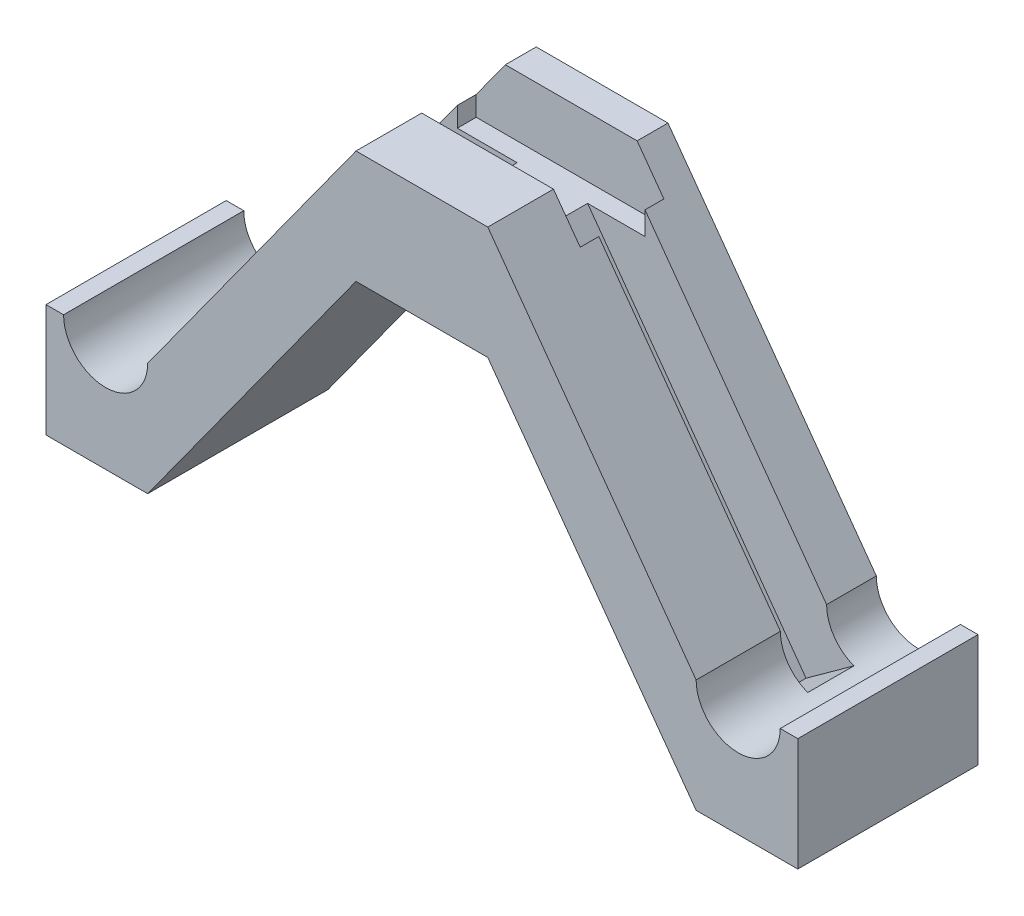
ISO-10303-21;
HEADER;
FILE_DESCRIPTION(('STEP AP214'),'2;1');
FILE_NAME('part.step','',(''),(''),'','','');
FILE_SCHEMA(('AUTOMOTIVE_DESIGN { 1 0 10303 214 1 1 1 1 }'));
ENDSEC;
DATA;
#1=APPLICATION_CONTEXT('core data for automotive mechanical design processes');
#2=APPLICATION_PROTOCOL_DEFINITION('international standard','automotive_design',2000,#1);
#3=PRODUCT_CONTEXT('',#1,'mechanical');
#4=PRODUCT('Part','Part','',(#3));
#5=PRODUCT_RELATED_PRODUCT_CATEGORY('part','',(#4));
#6=PRODUCT_DEFINITION_FORMATION('','',#4);
#7=PRODUCT_DEFINITION_CONTEXT('part definition',#1,'design');
#8=PRODUCT_DEFINITION('design','',#6,#7);
#9=PRODUCT_DEFINITION_SHAPE('','',#8);
#10=(LENGTH_UNIT() NAMED_UNIT(*) SI_UNIT(.MILLI.,.METRE.));
#11=(NAMED_UNIT(*) PLANE_ANGLE_UNIT() SI_UNIT($,.RADIAN.));
#12=(NAMED_UNIT(*) SI_UNIT($,.STERADIAN.) SOLID_ANGLE_UNIT());
#13=UNCERTAINTY_MEASURE_WITH_UNIT(LENGTH_MEASURE(1.E-05),#10,'distance_accuracy_value','');
#14=(GEOMETRIC_REPRESENTATION_CONTEXT(3) GLOBAL_UNCERTAINTY_ASSIGNED_CONTEXT((#13)) GLOBAL_UNIT_ASSIGNED_CONTEXT((#10,
#11,#12)) REPRESENTATION_CONTEXT('',''));
#15=CARTESIAN_POINT('',(0.,0.,0.));
#16=DIRECTION('',(0.,0.,1.));
#17=DIRECTION('',(1.,0.,0.));
#18=AXIS2_PLACEMENT_3D('',#15,#16,#17);
#19=CARTESIAN_POINT('',(52.6567164179104,-29.1492537313433,30.));
#20=DIRECTION('',(0.,0.,-1.));
#21=DIRECTION('',(-1.,0.,0.));
#22=AXIS2_PLACEMENT_3D('',#19,#20,#21);
#23=CYLINDRICAL_SURFACE('',#22,7.);
#24=CARTESIAN_POINT('',(52.6567164179104,-29.1492537313433,8.27759494661962));
#25=DIRECTION('',(0.,0.,1.));
#26=DIRECTION('',(1.,0.,0.));
#27=AXIS2_PLACEMENT_3D('',#24,#25,#26);
#28=CIRCLE('',#27,7.);
#29=CARTESIAN_POINT('',(50.2049097681717,-35.7058263232008,8.27759494661962));
#30=VERTEX_POINT('',#29);
#31=CARTESIAN_POINT('',(45.6567164179104,-29.1492537313433,8.27759494661962));
#32=VERTEX_POINT('',#31);
#33=EDGE_CURVE('E279',#30,#32,#28,.F.);
#34=ORIENTED_EDGE('',*,*,#33,.F.);
#35=DIRECTION('',(0.,0.,-1.));
#36=VECTOR('',#35,1.);
#37=CARTESIAN_POINT('',(50.2049097681717,-35.7058263232008,30.));
#38=LINE('',#37,#36);
#39=CARTESIAN_POINT('',(50.2049097681717,-35.7058263232008,15.9675295230244));
#40=VERTEX_POINT('',#39);
#41=EDGE_CURVE('E11',#40,#30,#38,.T.);
#42=ORIENTED_EDGE('',*,*,#41,.F.);
#43=CARTESIAN_POINT('',(52.6567164179104,-29.1492537313433,15.9675295230244));
#44=DIRECTION('',(0.,0.,-1.));
#45=DIRECTION('',(-1.,0.,0.));
#46=AXIS2_PLACEMENT_3D('',#43,#44,#45);
#47=CIRCLE('',#46,7.);
#48=CARTESIAN_POINT('',(45.6567164179104,-29.1492537313433,15.9675295230244));
#49=VERTEX_POINT('',#48);
#50=EDGE_CURVE('E259',#49,#40,#47,.F.);
#51=ORIENTED_EDGE('',*,*,#50,.F.);
#52=DIRECTION('',(0.,0.,-1.));
#53=VECTOR('',#52,1.);
#54=CARTESIAN_POINT('',(45.6567164179104,-29.1492537313433,30.));
#55=LINE('',#54,#53);
#56=CARTESIAN_POINT('',(45.6567164179104,-29.1492537313433,30.));
#57=VERTEX_POINT('',#56);
#58=EDGE_CURVE('E429',#57,#49,#55,.T.);
#59=ORIENTED_EDGE('',*,*,#58,.F.);
#60=CARTESIAN_POINT('',(52.6567164179104,-29.1492537313433,30.));
#61=DIRECTION('',(0.,0.,1.));
#62=DIRECTION('',(1.,0.,0.));
#63=AXIS2_PLACEMENT_3D('',#60,#61,#62);
#64=CIRCLE('',#63,7.);
#65=CARTESIAN_POINT('',(59.6567164179104,-29.1492537313433,30.));
#66=VERTEX_POINT('',#65);
#67=EDGE_CURVE('E370',#66,#57,#64,.F.);
#68=ORIENTED_EDGE('',*,*,#67,.F.);
#69=DIRECTION('',(0.,0.,-1.));
#70=VECTOR('',#69,1.);
#71=CARTESIAN_POINT('',(59.6567164179104,-29.1492537313433,30.));
#72=LINE('',#71,#70);
#73=CARTESIAN_POINT('',(59.6567164179104,-29.1492537313433,0.));
#74=VERTEX_POINT('',#73);
#75=EDGE_CURVE('E432',#66,#74,#72,.T.);
#76=ORIENTED_EDGE('',*,*,#75,.T.);
#77=CARTESIAN_POINT('',(52.6567164179104,-29.1492537313433,0.));
#78=DIRECTION('',(0.,0.,1.));
#79=DIRECTION('',(1.,0.,0.));
#80=AXIS2_PLACEMENT_3D('',#77,#78,#79);
#81=CIRCLE('',#80,7.);
#82=CARTESIAN_POINT('',(45.6567164179104,-29.1492537313433,0.));
#83=VERTEX_POINT('',#82);
#84=EDGE_CURVE('E406',#74,#83,#81,.F.);
#85=ORIENTED_EDGE('',*,*,#84,.T.);
#86=EDGE_CURVE('E428',#32,#83,#55,.T.);
#87=ORIENTED_EDGE('',*,*,#86,.F.);
#88=EDGE_LOOP('',(#34,#42,#51,#59,#68,#76,#85,#87));
#89=FACE_BOUND('',#88,.T.);
#90=ADVANCED_FACE('F35',(#89),#23,.F.);
#91=CARTESIAN_POINT('',(16.1325195744219,11.6688376878171,30.));
#92=DIRECTION('',(-0.810260081957919,-0.586070473224464,0.));
#93=DIRECTION('',(0.586070473224464,-0.810260081957919,0.));
#94=AXIS2_PLACEMENT_3D('',#91,#92,#93);
#95=PLANE('',#94);
#96=DIRECTION('',(0.586070473224464,-0.810260081957919,0.));
#97=VECTOR('',#96,1.);
#98=CARTESIAN_POINT('',(13.8879934345899,14.7719626823438,8.27759494661962));
#99=LINE('',#98,#97);
#100=CARTESIAN_POINT('',(15.4209091151518,12.6526605818079,8.27759494661962));
#101=VERTEX_POINT('',#100);
#102=EDGE_CURVE('E268',#101,#32,#99,.T.);
#103=ORIENTED_EDGE('',*,*,#102,.T.);
#104=ORIENTED_EDGE('',*,*,#86,.T.);
#105=DIRECTION('',(-0.586070473224464,0.810260081957919,0.));
#106=VECTOR('',#105,1.);
#107=CARTESIAN_POINT('',(16.1325195744219,11.6688376878171,0.));
#108=LINE('',#107,#106);
#109=CARTESIAN_POINT('',(10.9701492537313,18.8059701492538,0.));
#110=VERTEX_POINT('',#109);
#111=EDGE_CURVE('E409',#83,#110,#108,.T.);
#112=ORIENTED_EDGE('',*,*,#111,.T.);
#113=DIRECTION('',(0.,0.,-1.));
#114=VECTOR('',#113,1.);
#115=CARTESIAN_POINT('',(10.9701492537313,18.8059701492538,30.));
#116=LINE('',#115,#114);
#117=CARTESIAN_POINT('',(10.9701492537313,18.8059701492538,5.13736719640745));
#118=VERTEX_POINT('',#117);
#119=EDGE_CURVE('E424',#118,#110,#116,.T.);
#120=ORIENTED_EDGE('',*,*,#119,.F.);
#121=DIRECTION('',(0.586070473224464,-0.810260081957919,0.));
#122=VECTOR('',#121,1.);
#123=CARTESIAN_POINT('',(16.1325195744219,11.6688376878171,5.13736719640745));
#124=LINE('',#123,#122);
#125=CARTESIAN_POINT('',(15.4209091151518,12.652660581808,5.13736719640745));
#126=VERTEX_POINT('',#125);
#127=EDGE_CURVE('E328',#118,#126,#124,.T.);
#128=ORIENTED_EDGE('',*,*,#127,.T.);
#129=DIRECTION('',(0.,0.,1.));
#130=VECTOR('',#129,1.);
#131=CARTESIAN_POINT('',(15.4209091151518,12.652660581808,30.));
#132=LINE('',#131,#130);
#133=EDGE_CURVE('E465',#126,#101,#132,.T.);
#134=ORIENTED_EDGE('',*,*,#133,.T.);
#135=EDGE_LOOP('',(#103,#104,#112,#120,#128,#134));
#136=FACE_BOUND('',#135,.T.);
#137=ADVANCED_FACE('F560',(#136),#95,.F.);
#138=DIRECTION('',(-0.586070473224464,0.810260081957919,0.));
#139=VECTOR('',#138,1.);
#140=CARTESIAN_POINT('',(13.8879934345899,14.7719626823438,15.9675295230244));
#141=LINE('',#140,#139);
#142=CARTESIAN_POINT('',(15.4209091151518,12.6526605818079,15.9675295230244));
#143=VERTEX_POINT('',#142);
#144=EDGE_CURVE('E265',#49,#143,#141,.T.);
#145=ORIENTED_EDGE('',*,*,#144,.T.);
#146=CARTESIAN_POINT('',(15.4209091151518,12.652660581808,19.0653529446849));
#147=VERTEX_POINT('',#146);
#148=EDGE_CURVE('E464',#143,#147,#132,.T.);
#149=ORIENTED_EDGE('',*,*,#148,.T.);
#150=DIRECTION('',(-0.586070473224464,0.810260081957919,0.));
#151=VECTOR('',#150,1.);
#152=CARTESIAN_POINT('',(16.1325195744219,11.6688376878171,19.0653529446849));
#153=LINE('',#152,#151);
#154=CARTESIAN_POINT('',(10.9701492537313,18.8059701492538,19.0653529446849));
#155=VERTEX_POINT('',#154);
#156=EDGE_CURVE('E339',#147,#155,#153,.T.);
#157=ORIENTED_EDGE('',*,*,#156,.T.);
#158=CARTESIAN_POINT('',(10.9701492537313,18.8059701492538,30.));
#159=VERTEX_POINT('',#158);
#160=EDGE_CURVE('E425',#159,#155,#116,.T.);
#161=ORIENTED_EDGE('',*,*,#160,.F.);
#162=DIRECTION('',(-0.586070473224464,0.810260081957919,0.));
#163=VECTOR('',#162,1.);
#164=CARTESIAN_POINT('',(16.1325195744219,11.6688376878171,30.));
#165=LINE('',#164,#163);
#166=EDGE_CURVE('E372',#57,#159,#165,.T.);
#167=ORIENTED_EDGE('',*,*,#166,.F.);
#168=ORIENTED_EDGE('',*,*,#58,.T.);
#169=EDGE_LOOP('',(#145,#149,#157,#161,#167,#168));
#170=FACE_BOUND('',#169,.T.);
#171=ADVANCED_FACE('F550',(#170),#95,.F.);
#172=CARTESIAN_POINT('',(15.4209091151518,8.80597014925375,19.0653529446849));
#173=DIRECTION('',(1.,0.,0.));
#174=DIRECTION('',(0.,0.,-1.));
#175=AXIS2_PLACEMENT_3D('',#172,#173,#174);
#176=PLANE('',#175);
#177=DIRECTION('',(0.,-1.,0.));
#178=VECTOR('',#177,1.);
#179=CARTESIAN_POINT('',(15.4209091151518,8.80597014925375,8.27759494661962));
#180=LINE('',#179,#178);
#181=CARTESIAN_POINT('',(15.4209091151518,8.80597014925375,8.27759494661962));
#182=VERTEX_POINT('',#181);
#183=EDGE_CURVE('E277',#101,#182,#180,.T.);
#184=ORIENTED_EDGE('',*,*,#183,.F.);
#185=ORIENTED_EDGE('',*,*,#133,.F.);
#186=DIRECTION('',(0.,1.,0.));
#187=VECTOR('',#186,1.);
#188=CARTESIAN_POINT('',(15.4209091151518,8.80597014925375,5.13736719640745));
#189=LINE('',#188,#187);
#190=CARTESIAN_POINT('',(15.4209091151518,8.80597014925375,5.13736719640745));
#191=VERTEX_POINT('',#190);
#192=EDGE_CURVE('E321',#191,#126,#189,.T.);
#193=ORIENTED_EDGE('',*,*,#192,.F.);
#194=DIRECTION('',(0.,0.,-1.));
#195=VECTOR('',#194,1.);
#196=CARTESIAN_POINT('',(15.4209091151518,8.80597014925375,19.0653529446849));
#197=LINE('',#196,#195);
#198=EDGE_CURVE('E311',#182,#191,#197,.T.);
#199=ORIENTED_EDGE('',*,*,#198,.F.);
#200=EDGE_LOOP('',(#184,#185,#193,#199));
#201=FACE_BOUND('',#200,.T.);
#202=ADVANCED_FACE('F487',(#201),#176,.F.);
#203=DIRECTION('',(0.,1.,0.));
#204=VECTOR('',#203,1.);
#205=CARTESIAN_POINT('',(15.4209091151518,8.80597014925375,15.9675295230244));
#206=LINE('',#205,#204);
#207=CARTESIAN_POINT('',(15.4209091151518,8.80597014925375,15.9675295230244));
#208=VERTEX_POINT('',#207);
#209=EDGE_CURVE('E273',#208,#143,#206,.T.);
#210=ORIENTED_EDGE('',*,*,#209,.F.);
#211=CARTESIAN_POINT('',(15.4209091151518,8.80597014925375,19.0653529446849));
#212=VERTEX_POINT('',#211);
#213=EDGE_CURVE('E307',#212,#208,#197,.T.);
#214=ORIENTED_EDGE('',*,*,#213,.F.);
#215=DIRECTION('',(0.,1.,0.));
#216=VECTOR('',#215,1.);
#217=CARTESIAN_POINT('',(15.4209091151518,8.80597014925375,19.0653529446849));
#218=LINE('',#217,#216);
#219=EDGE_CURVE('E325',#212,#147,#218,.T.);
#220=ORIENTED_EDGE('',*,*,#219,.T.);
#221=ORIENTED_EDGE('',*,*,#148,.F.);
#222=EDGE_LOOP('',(#210,#214,#220,#221));
#223=FACE_BOUND('',#222,.T.);
#224=ADVANCED_FACE('F547',(#223),#176,.F.);
#225=CARTESIAN_POINT('',(0.,8.80597014925375,0.));
#226=DIRECTION('',(0.,1.,0.));
#227=DIRECTION('',(0.,0.,1.));
#228=AXIS2_PLACEMENT_3D('',#225,#226,#227);
#229=PLANE('',#228);
#230=DIRECTION('',(0.,0.,-1.));
#231=VECTOR('',#230,1.);
#232=CARTESIAN_POINT('',(5.86154849710371,8.80597014925375,0.));
#233=LINE('',#232,#231);
#234=CARTESIAN_POINT('',(5.86154849710372,8.80597014925376,15.9675295230244));
#235=VERTEX_POINT('',#234);
#236=CARTESIAN_POINT('',(5.86154849710371,8.80597014925375,8.27759494661962));
#237=VERTEX_POINT('',#236);
#238=EDGE_CURVE('E263',#235,#237,#233,.T.);
#239=ORIENTED_EDGE('',*,*,#238,.T.);
#240=DIRECTION('',(1.,0.,0.));
#241=VECTOR('',#240,1.);
#242=CARTESIAN_POINT('',(0.,8.80597014925375,8.27759494661962));
#243=LINE('',#242,#241);
#244=EDGE_CURVE('E43',#237,#182,#243,.T.);
#245=ORIENTED_EDGE('',*,*,#244,.T.);
#246=ORIENTED_EDGE('',*,*,#198,.T.);
#247=DIRECTION('',(-1.,0.,0.));
#248=VECTOR('',#247,1.);
#249=CARTESIAN_POINT('',(15.4209091151518,8.80597014925375,5.13736719640745));
#250=LINE('',#249,#248);
#251=CARTESIAN_POINT('',(-15.8195829454986,8.80597014925375,5.13736719640745));
#252=VERTEX_POINT('',#251);
#253=EDGE_CURVE('E310',#191,#252,#250,.T.);
#254=ORIENTED_EDGE('',*,*,#253,.T.);
#255=DIRECTION('',(0.,0.,1.));
#256=VECTOR('',#255,1.);
#257=CARTESIAN_POINT('',(-15.8195829454986,8.80597014925375,19.0653529446849));
#258=LINE('',#257,#256);
#259=CARTESIAN_POINT('',(-15.8195829454986,8.80597014925375,8.27759494661962));
#260=VERTEX_POINT('',#259);
#261=EDGE_CURVE('E315',#252,#260,#258,.T.);
#262=ORIENTED_EDGE('',*,*,#261,.T.);
#263=DIRECTION('',(-1.,0.,0.));
#264=VECTOR('',#263,1.);
#265=CARTESIAN_POINT('',(0.,8.80597014925375,8.27759494661962));
#266=LINE('',#265,#264);
#267=CARTESIAN_POINT('',(-5.86154849710372,8.80597014925376,8.27759494661962));
#268=VERTEX_POINT('',#267);
#269=EDGE_CURVE('E473',#268,#260,#266,.T.);
#270=ORIENTED_EDGE('',*,*,#269,.F.);
#271=DIRECTION('',(0.,0.,1.));
#272=VECTOR('',#271,1.);
#273=CARTESIAN_POINT('',(-5.86154849710371,8.80597014925375,0.));
#274=LINE('',#273,#272);
#275=CARTESIAN_POINT('',(-5.86154849710371,8.80597014925375,15.9675295230244));
#276=VERTEX_POINT('',#275);
#277=EDGE_CURVE('E468',#268,#276,#274,.T.);
#278=ORIENTED_EDGE('',*,*,#277,.T.);
#279=DIRECTION('',(1.,0.,0.));
#280=VECTOR('',#279,1.);
#281=CARTESIAN_POINT('',(0.,8.80597014925375,15.9675295230244));
#282=LINE('',#281,#280);
#283=CARTESIAN_POINT('',(-15.8195829454986,8.80597014925375,15.9675295230244));
#284=VERTEX_POINT('',#283);
#285=EDGE_CURVE('E471',#284,#276,#282,.T.);
#286=ORIENTED_EDGE('',*,*,#285,.F.);
#287=CARTESIAN_POINT('',(-15.8195829454986,8.80597014925375,19.0653529446849));
#288=VERTEX_POINT('',#287);
#289=EDGE_CURVE('E314',#284,#288,#258,.T.);
#290=ORIENTED_EDGE('',*,*,#289,.T.);
#291=DIRECTION('',(1.,0.,0.));
#292=VECTOR('',#291,1.);
#293=CARTESIAN_POINT('',(15.4209091151518,8.80597014925375,19.0653529446849));
#294=LINE('',#293,#292);
#295=EDGE_CURVE('E318',#288,#212,#294,.T.);
#296=ORIENTED_EDGE('',*,*,#295,.T.);
#297=ORIENTED_EDGE('',*,*,#213,.T.);
#298=DIRECTION('',(-1.,0.,0.));
#299=VECTOR('',#298,1.);
#300=CARTESIAN_POINT('',(0.,8.80597014925375,15.9675295230244));
#301=LINE('',#300,#299);
#302=EDGE_CURVE('E478',#208,#235,#301,.T.);
#303=ORIENTED_EDGE('',*,*,#302,.T.);
#304=EDGE_LOOP('',(#239,#245,#246,#254,#262,#270,#278,#286,#290,#296,#297,#303));
#305=FACE_BOUND('',#304,.T.);
#306=ADVANCED_FACE('F482',(#305),#229,.T.);
#307=CARTESIAN_POINT('',(-16.1325195744219,11.6688376878171,30.));
#308=DIRECTION('',(-0.810260081957919,0.586070473224464,0.));
#309=DIRECTION('',(-0.586070473224464,-0.810260081957919,0.));
#310=AXIS2_PLACEMENT_3D('',#307,#308,#309);
#311=PLANE('',#310);
#312=DIRECTION('',(-0.586070473224464,-0.810260081957919,0.));
#313=VECTOR('',#312,1.);
#314=CARTESIAN_POINT('',(-13.8879934345899,14.7719626823438,8.27759494661962));
#315=LINE('',#314,#313);
#316=CARTESIAN_POINT('',(-15.8195829454986,12.1014820031057,8.27759494661962));
#317=VERTEX_POINT('',#316);
#318=CARTESIAN_POINT('',(-45.6567164179104,-29.1492537313433,8.27759494661962));
#319=VERTEX_POINT('',#318);
#320=EDGE_CURVE('E281',#317,#319,#315,.T.);
#321=ORIENTED_EDGE('',*,*,#320,.F.);
#322=DIRECTION('',(0.,0.,1.));
#323=VECTOR('',#322,1.);
#324=CARTESIAN_POINT('',(-15.8195829454986,12.1014820031057,30.));
#325=LINE('',#324,#323);
#326=CARTESIAN_POINT('',(-15.8195829454986,12.1014820031057,5.13736719640745));
#327=VERTEX_POINT('',#326);
#328=EDGE_CURVE('E459',#327,#317,#325,.T.);
#329=ORIENTED_EDGE('',*,*,#328,.F.);
#330=DIRECTION('',(-0.586070473224464,-0.810260081957919,0.));
#331=VECTOR('',#330,1.);
#332=CARTESIAN_POINT('',(-16.1325195744219,11.6688376878171,5.13736719640745));
#333=LINE('',#332,#331);
#334=CARTESIAN_POINT('',(-10.9701492537313,18.8059701492538,5.13736719640745));
#335=VERTEX_POINT('',#334);
#336=EDGE_CURVE('E456',#335,#327,#333,.T.);
#337=ORIENTED_EDGE('',*,*,#336,.F.);
#338=DIRECTION('',(0.,0.,-1.));
#339=VECTOR('',#338,1.);
#340=CARTESIAN_POINT('',(-10.9701492537313,18.8059701492538,30.));
#341=LINE('',#340,#339);
#342=CARTESIAN_POINT('',(-10.9701492537313,18.8059701492538,0.));
#343=VERTEX_POINT('',#342);
#344=EDGE_CURVE('E420',#335,#343,#341,.T.);
#345=ORIENTED_EDGE('',*,*,#344,.T.);
#346=DIRECTION('',(0.586070473224464,0.810260081957919,0.));
#347=VECTOR('',#346,1.);
#348=CARTESIAN_POINT('',(-16.1325195744219,11.6688376878171,0.));
#349=LINE('',#348,#347);
#350=CARTESIAN_POINT('',(-45.6567164179104,-29.1492537313433,0.));
#351=VERTEX_POINT('',#350);
#352=EDGE_CURVE('E347',#351,#343,#349,.T.);
#353=ORIENTED_EDGE('',*,*,#352,.F.);
#354=DIRECTION('',(0.,0.,-1.));
#355=VECTOR('',#354,1.);
#356=CARTESIAN_POINT('',(-45.6567164179104,-29.1492537313433,30.));
#357=LINE('',#356,#355);
#358=EDGE_CURVE('E380',#319,#351,#357,.T.);
#359=ORIENTED_EDGE('',*,*,#358,.F.);
#360=EDGE_LOOP('',(#321,#329,#337,#345,#353,#359));
#361=FACE_BOUND('',#360,.T.);
#362=ADVANCED_FACE('F503',(#361),#311,.T.);
#363=CARTESIAN_POINT('',(-15.8195829454986,8.80597014925375,19.0653529446849));
#364=DIRECTION('',(-1.,0.,0.));
#365=DIRECTION('',(0.,0.,1.));
#366=AXIS2_PLACEMENT_3D('',#363,#364,#365);
#367=PLANE('',#366);
#368=ORIENTED_EDGE('',*,*,#328,.T.);
#369=DIRECTION('',(0.,-1.,0.));
#370=VECTOR('',#369,1.);
#371=CARTESIAN_POINT('',(-15.8195829454986,8.80597014925375,8.27759494661962));
#372=LINE('',#371,#370);
#373=EDGE_CURVE('E301',#317,#260,#372,.T.);
#374=ORIENTED_EDGE('',*,*,#373,.T.);
#375=ORIENTED_EDGE('',*,*,#261,.F.);
#376=DIRECTION('',(0.,1.,0.));
#377=VECTOR('',#376,1.);
#378=CARTESIAN_POINT('',(-15.8195829454986,8.80597014925375,5.13736719640745));
#379=LINE('',#378,#377);
#380=EDGE_CURVE('E332',#252,#327,#379,.T.);
#381=ORIENTED_EDGE('',*,*,#380,.T.);
#382=EDGE_LOOP('',(#368,#374,#375,#381));
#383=FACE_BOUND('',#382,.T.);
#384=ADVANCED_FACE('F494',(#383),#367,.F.);
#385=CARTESIAN_POINT('',(0.,18.8059701492538,30.));
#386=DIRECTION('',(0.,1.,0.));
#387=DIRECTION('',(0.,0.,1.));
#388=AXIS2_PLACEMENT_3D('',#385,#386,#387);
#389=PLANE('',#388);
#390=DIRECTION('',(1.,0.,0.));
#391=VECTOR('',#390,1.);
#392=CARTESIAN_POINT('',(15.4209091151518,18.8059701492538,19.0653529446849));
#393=LINE('',#392,#391);
#394=CARTESIAN_POINT('',(-10.9701492537313,18.8059701492538,19.0653529446849));
#395=VERTEX_POINT('',#394);
#396=EDGE_CURVE('E323',#395,#155,#393,.T.);
#397=ORIENTED_EDGE('',*,*,#396,.F.);
#398=CARTESIAN_POINT('',(-10.9701492537313,18.8059701492538,30.));
#399=VERTEX_POINT('',#398);
#400=EDGE_CURVE('E421',#399,#395,#341,.T.);
#401=ORIENTED_EDGE('',*,*,#400,.F.);
#402=DIRECTION('',(1.,0.,0.));
#403=VECTOR('',#402,1.);
#404=CARTESIAN_POINT('',(0.,18.8059701492538,30.));
#405=LINE('',#404,#403);
#406=EDGE_CURVE('E374',#399,#159,#405,.T.);
#407=ORIENTED_EDGE('',*,*,#406,.T.);
#408=ORIENTED_EDGE('',*,*,#160,.T.);
#409=EDGE_LOOP('',(#397,#401,#407,#408));
#410=FACE_BOUND('',#409,.T.);
#411=ADVANCED_FACE('F574',(#410),#389,.T.);
#412=CARTESIAN_POINT('',(-52.6567164179104,-29.1492537313433,30.));
#413=DIRECTION('',(0.,0.,-1.));
#414=DIRECTION('',(-1.,0.,0.));
#415=AXIS2_PLACEMENT_3D('',#412,#413,#414);
#416=CYLINDRICAL_SURFACE('',#415,7.);
#417=CARTESIAN_POINT('',(-52.6567164179104,-29.1492537313433,8.27759494661962));
#418=DIRECTION('',(0.,0.,-1.));
#419=DIRECTION('',(-1.,0.,0.));
#420=AXIS2_PLACEMENT_3D('',#417,#418,#419);
#421=CIRCLE('',#420,7.);
#422=CARTESIAN_POINT('',(-50.2049097681717,-35.7058263232008,8.27759494661962));
#423=VERTEX_POINT('',#422);
#424=EDGE_CURVE('E304',#319,#423,#421,.T.);
#425=ORIENTED_EDGE('',*,*,#424,.F.);
#426=ORIENTED_EDGE('',*,*,#358,.T.);
#427=CARTESIAN_POINT('',(-52.6567164179104,-29.1492537313433,0.));
#428=DIRECTION('',(0.,0.,1.));
#429=DIRECTION('',(1.,0.,0.));
#430=AXIS2_PLACEMENT_3D('',#427,#428,#429);
#431=CIRCLE('',#430,7.);
#432=CARTESIAN_POINT('',(-59.6567164179104,-29.1492537313433,0.));
#433=VERTEX_POINT('',#432);
#434=EDGE_CURVE('E342',#433,#351,#431,.T.);
#435=ORIENTED_EDGE('',*,*,#434,.F.);
#436=DIRECTION('',(0.,0.,-1.));
#437=VECTOR('',#436,1.);
#438=CARTESIAN_POINT('',(-59.6567164179104,-29.1492537313433,30.));
#439=LINE('',#438,#437);
#440=CARTESIAN_POINT('',(-59.6567164179104,-29.1492537313433,30.));
#441=VERTEX_POINT('',#440);
#442=EDGE_CURVE('E454',#441,#433,#439,.T.);
#443=ORIENTED_EDGE('',*,*,#442,.F.);
#444=CARTESIAN_POINT('',(-52.6567164179104,-29.1492537313433,30.));
#445=DIRECTION('',(0.,0.,1.));
#446=DIRECTION('',(1.,0.,0.));
#447=AXIS2_PLACEMENT_3D('',#444,#445,#446);
#448=CIRCLE('',#447,7.);
#449=CARTESIAN_POINT('',(-45.6567164179104,-29.1492537313433,30.));
#450=VERTEX_POINT('',#449);
#451=EDGE_CURVE('E343',#441,#450,#448,.T.);
#452=ORIENTED_EDGE('',*,*,#451,.T.);
#453=CARTESIAN_POINT('',(-45.6567164179104,-29.1492537313433,15.9675295230244));
#454=VERTEX_POINT('',#453);
#455=EDGE_CURVE('E417',#450,#454,#357,.T.);
#456=ORIENTED_EDGE('',*,*,#455,.T.);
#457=CARTESIAN_POINT('',(-52.6567164179104,-29.1492537313433,15.9675295230244));
#458=DIRECTION('',(0.,0.,1.));
#459=DIRECTION('',(1.,0.,0.));
#460=AXIS2_PLACEMENT_3D('',#457,#458,#459);
#461=CIRCLE('',#460,7.);
#462=CARTESIAN_POINT('',(-50.2049097681717,-35.7058263232008,15.9675295230244));
#463=VERTEX_POINT('',#462);
#464=EDGE_CURVE('E299',#463,#454,#461,.T.);
#465=ORIENTED_EDGE('',*,*,#464,.F.);
#466=DIRECTION('',(0.,0.,-1.));
#467=VECTOR('',#466,1.);
#468=CARTESIAN_POINT('',(-50.2049097681717,-35.7058263232008,30.));
#469=LINE('',#468,#467);
#470=EDGE_CURVE('E475',#423,#463,#469,.F.);
#471=ORIENTED_EDGE('',*,*,#470,.F.);
#472=EDGE_LOOP('',(#425,#426,#435,#443,#452,#456,#465,#471));
#473=FACE_BOUND('',#472,.T.);
#474=ADVANCED_FACE('F37',(#473),#416,.F.);
#475=CARTESIAN_POINT('',(0.,-29.1492537313433,30.));
#476=DIRECTION('',(0.,1.,0.));
#477=DIRECTION('',(0.,0.,1.));
#478=AXIS2_PLACEMENT_3D('',#475,#476,#477);
#479=PLANE('',#478);
#480=DIRECTION('',(1.,0.,0.));
#481=VECTOR('',#480,1.);
#482=CARTESIAN_POINT('',(0.,-29.1492537313433,0.));
#483=LINE('',#482,#481);
#484=CARTESIAN_POINT('',(-62.5820895522388,-29.1492537313433,0.));
#485=VERTEX_POINT('',#484);
#486=EDGE_CURVE('E383',#485,#433,#483,.T.);
#487=ORIENTED_EDGE('',*,*,#486,.F.);
#488=DIRECTION('',(0.,0.,-1.));
#489=VECTOR('',#488,1.);
#490=CARTESIAN_POINT('',(-62.5820895522388,-29.1492537313433,30.));
#491=LINE('',#490,#489);
#492=CARTESIAN_POINT('',(-62.5820895522388,-29.1492537313433,30.));
#493=VERTEX_POINT('',#492);
#494=EDGE_CURVE('E452',#493,#485,#491,.T.);
#495=ORIENTED_EDGE('',*,*,#494,.F.);
#496=DIRECTION('',(1.,0.,0.));
#497=VECTOR('',#496,1.);
#498=CARTESIAN_POINT('',(0.,-29.1492537313433,30.));
#499=LINE('',#498,#497);
#500=EDGE_CURVE('E346',#493,#441,#499,.T.);
#501=ORIENTED_EDGE('',*,*,#500,.T.);
#502=ORIENTED_EDGE('',*,*,#442,.T.);
#503=EDGE_LOOP('',(#487,#495,#501,#502));
#504=FACE_BOUND('',#503,.T.);
#505=ADVANCED_FACE('F514',(#504),#479,.T.);
#506=CARTESIAN_POINT('',(-62.5820895522388,0.,30.));
#507=DIRECTION('',(-1.,0.,0.));
#508=DIRECTION('',(0.,0.,1.));
#509=AXIS2_PLACEMENT_3D('',#506,#507,#508);
#510=PLANE('',#509);
#511=DIRECTION('',(0.,1.,0.));
#512=VECTOR('',#511,1.);
#513=CARTESIAN_POINT('',(-62.5820895522388,0.,0.));
#514=LINE('',#513,#512);
#515=CARTESIAN_POINT('',(-62.5820895522388,-47.955223880597,0.));
#516=VERTEX_POINT('',#515);
#517=EDGE_CURVE('E386',#516,#485,#514,.T.);
#518=ORIENTED_EDGE('',*,*,#517,.F.);
#519=DIRECTION('',(0.,0.,-1.));
#520=VECTOR('',#519,1.);
#521=CARTESIAN_POINT('',(-62.5820895522388,-47.955223880597,30.));
#522=LINE('',#521,#520);
#523=CARTESIAN_POINT('',(-62.5820895522388,-47.955223880597,30.));
#524=VERTEX_POINT('',#523);
#525=EDGE_CURVE('E450',#524,#516,#522,.T.);
#526=ORIENTED_EDGE('',*,*,#525,.F.);
#527=DIRECTION('',(0.,1.,0.));
#528=VECTOR('',#527,1.);
#529=CARTESIAN_POINT('',(-62.5820895522388,0.,30.));
#530=LINE('',#529,#528);
#531=EDGE_CURVE('E350',#524,#493,#530,.T.);
#532=ORIENTED_EDGE('',*,*,#531,.T.);
#533=ORIENTED_EDGE('',*,*,#494,.T.);
#534=EDGE_LOOP('',(#518,#526,#532,#533));
#535=FACE_BOUND('',#534,.T.);
#536=ADVANCED_FACE('F614',(#535),#510,.T.);
#537=CARTESIAN_POINT('',(0.,-47.955223880597,30.));
#538=DIRECTION('',(0.,-1.,0.));
#539=DIRECTION('',(0.,0.,-1.));
#540=AXIS2_PLACEMENT_3D('',#537,#538,#539);
#541=PLANE('',#540);
#542=DIRECTION('',(-1.,0.,0.));
#543=VECTOR('',#542,1.);
#544=CARTESIAN_POINT('',(0.,-47.955223880597,0.));
#545=LINE('',#544,#543);
#546=CARTESIAN_POINT('',(-45.6567164179104,-47.955223880597,0.));
#547=VERTEX_POINT('',#546);
#548=EDGE_CURVE('E389',#547,#516,#545,.T.);
#549=ORIENTED_EDGE('',*,*,#548,.F.);
#550=DIRECTION('',(0.,0.,-1.));
#551=VECTOR('',#550,1.);
#552=CARTESIAN_POINT('',(-45.6567164179104,-47.955223880597,30.));
#553=LINE('',#552,#551);
#554=CARTESIAN_POINT('',(-45.6567164179104,-47.955223880597,30.));
#555=VERTEX_POINT('',#554);
#556=EDGE_CURVE('E448',#555,#547,#553,.T.);
#557=ORIENTED_EDGE('',*,*,#556,.F.);
#558=DIRECTION('',(-1.,0.,0.));
#559=VECTOR('',#558,1.);
#560=CARTESIAN_POINT('',(0.,-47.955223880597,30.));
#561=LINE('',#560,#559);
#562=EDGE_CURVE('E353',#555,#524,#561,.T.);
#563=ORIENTED_EDGE('',*,*,#562,.T.);
#564=ORIENTED_EDGE('',*,*,#525,.T.);
#565=EDGE_LOOP('',(#549,#557,#563,#564));
#566=FACE_BOUND('',#565,.T.);
#567=ADVANCED_FACE('F610',(#566),#541,.T.);
#568=CARTESIAN_POINT('',(-7.20213775081526,5.20938939710385,30.));
#569=DIRECTION('',(0.810260081957919,-0.586070473224464,0.));
#570=DIRECTION('',(0.586070473224464,0.810260081957919,0.));
#571=AXIS2_PLACEMENT_3D('',#568,#569,#570);
#572=PLANE('',#571);
#573=DIRECTION('',(-0.586070473224464,-0.810260081957919,0.));
#574=VECTOR('',#573,1.);
#575=CARTESIAN_POINT('',(-7.20213775081526,5.20938939710385,0.));
#576=LINE('',#575,#574);
#577=CARTESIAN_POINT('',(-10.9701492537313,0.,0.));
#578=VERTEX_POINT('',#577);
#579=EDGE_CURVE('E392',#578,#547,#576,.T.);
#580=ORIENTED_EDGE('',*,*,#579,.F.);
#581=DIRECTION('',(0.,0.,-1.));
#582=VECTOR('',#581,1.);
#583=CARTESIAN_POINT('',(-10.9701492537313,0.,30.));
#584=LINE('',#583,#582);
#585=CARTESIAN_POINT('',(-10.9701492537313,0.,30.));
#586=VERTEX_POINT('',#585);
#587=EDGE_CURVE('E446',#586,#578,#584,.T.);
#588=ORIENTED_EDGE('',*,*,#587,.F.);
#589=DIRECTION('',(-0.586070473224464,-0.810260081957919,0.));
#590=VECTOR('',#589,1.);
#591=CARTESIAN_POINT('',(-7.20213775081526,5.20938939710385,30.));
#592=LINE('',#591,#590);
#593=EDGE_CURVE('E356',#586,#555,#592,.T.);
#594=ORIENTED_EDGE('',*,*,#593,.T.);
#595=ORIENTED_EDGE('',*,*,#556,.T.);
#596=EDGE_LOOP('',(#580,#588,#594,#595));
#597=FACE_BOUND('',#596,.T.);
#598=ADVANCED_FACE('F606',(#597),#572,.T.);
#599=CARTESIAN_POINT('',(0.,0.,30.));
#600=DIRECTION('',(0.,-1.,0.));
#601=DIRECTION('',(0.,0.,-1.));
#602=AXIS2_PLACEMENT_3D('',#599,#600,#601);
#603=PLANE('',#602);
#604=DIRECTION('',(-1.,0.,0.));
#605=VECTOR('',#604,1.);
#606=CARTESIAN_POINT('',(0.,0.,0.));
#607=LINE('',#606,#605);
#608=CARTESIAN_POINT('',(10.9701492537313,0.,0.));
#609=VERTEX_POINT('',#608);
#610=EDGE_CURVE('E395',#609,#578,#607,.T.);
#611=ORIENTED_EDGE('',*,*,#610,.F.);
#612=DIRECTION('',(0.,0.,-1.));
#613=VECTOR('',#612,1.);
#614=CARTESIAN_POINT('',(10.9701492537313,0.,30.));
#615=LINE('',#614,#613);
#616=CARTESIAN_POINT('',(10.9701492537313,0.,30.));
#617=VERTEX_POINT('',#616);
#618=EDGE_CURVE('E444',#617,#609,#615,.T.);
#619=ORIENTED_EDGE('',*,*,#618,.F.);
#620=DIRECTION('',(-1.,0.,0.));
#621=VECTOR('',#620,1.);
#622=CARTESIAN_POINT('',(0.,0.,30.));
#623=LINE('',#622,#621);
#624=EDGE_CURVE('E359',#617,#586,#623,.T.);
#625=ORIENTED_EDGE('',*,*,#624,.T.);
#626=ORIENTED_EDGE('',*,*,#587,.T.);
#627=EDGE_LOOP('',(#611,#619,#625,#626));
#628=FACE_BOUND('',#627,.T.);
#629=ADVANCED_FACE('F602',(#628),#603,.T.);
#630=CARTESIAN_POINT('',(7.20213775081526,5.20938939710385,30.));
#631=DIRECTION('',(0.810260081957919,0.586070473224464,0.));
#632=DIRECTION('',(-0.586070473224464,0.810260081957919,0.));
#633=AXIS2_PLACEMENT_3D('',#630,#631,#632);
#634=PLANE('',#633);
#635=DIRECTION('',(0.586070473224464,-0.810260081957919,0.));
#636=VECTOR('',#635,1.);
#637=CARTESIAN_POINT('',(7.20213775081526,5.20938939710385,0.));
#638=LINE('',#637,#636);
#639=CARTESIAN_POINT('',(45.6567164179104,-47.955223880597,0.));
#640=VERTEX_POINT('',#639);
#641=EDGE_CURVE('E398',#609,#640,#638,.T.);
#642=ORIENTED_EDGE('',*,*,#641,.T.);
#643=DIRECTION('',(0.,0.,-1.));
#644=VECTOR('',#643,1.);
#645=CARTESIAN_POINT('',(45.6567164179104,-47.955223880597,30.));
#646=LINE('',#645,#644);
#647=CARTESIAN_POINT('',(45.6567164179104,-47.955223880597,30.));
#648=VERTEX_POINT('',#647);
#649=EDGE_CURVE('E441',#648,#640,#646,.T.);
#650=ORIENTED_EDGE('',*,*,#649,.F.);
#651=DIRECTION('',(0.586070473224464,-0.810260081957919,0.));
#652=VECTOR('',#651,1.);
#653=CARTESIAN_POINT('',(7.20213775081526,5.20938939710385,30.));
#654=LINE('',#653,#652);
#655=EDGE_CURVE('E362',#617,#648,#654,.T.);
#656=ORIENTED_EDGE('',*,*,#655,.F.);
#657=ORIENTED_EDGE('',*,*,#618,.T.);
#658=EDGE_LOOP('',(#642,#650,#656,#657));
#659=FACE_BOUND('',#658,.T.);
#660=ADVANCED_FACE('F598',(#659),#634,.F.);
#661=CARTESIAN_POINT('',(0.,-47.955223880597,30.));
#662=DIRECTION('',(0.,1.,0.));
#663=DIRECTION('',(0.,0.,1.));
#664=AXIS2_PLACEMENT_3D('',#661,#662,#663);
#665=PLANE('',#664);
#666=DIRECTION('',(1.,0.,0.));
#667=VECTOR('',#666,1.);
#668=CARTESIAN_POINT('',(0.,-47.955223880597,0.));
#669=LINE('',#668,#667);
#670=CARTESIAN_POINT('',(62.5820895522388,-47.955223880597,0.));
#671=VERTEX_POINT('',#670);
#672=EDGE_CURVE('E400',#640,#671,#669,.T.);
#673=ORIENTED_EDGE('',*,*,#672,.T.);
#674=DIRECTION('',(0.,0.,-1.));
#675=VECTOR('',#674,1.);
#676=CARTESIAN_POINT('',(62.5820895522388,-47.955223880597,30.));
#677=LINE('',#676,#675);
#678=CARTESIAN_POINT('',(62.5820895522388,-47.955223880597,30.));
#679=VERTEX_POINT('',#678);
#680=EDGE_CURVE('E438',#679,#671,#677,.T.);
#681=ORIENTED_EDGE('',*,*,#680,.F.);
#682=DIRECTION('',(1.,0.,0.));
#683=VECTOR('',#682,1.);
#684=CARTESIAN_POINT('',(0.,-47.955223880597,30.));
#685=LINE('',#684,#683);
#686=EDGE_CURVE('E364',#648,#679,#685,.T.);
#687=ORIENTED_EDGE('',*,*,#686,.F.);
#688=ORIENTED_EDGE('',*,*,#649,.T.);
#689=EDGE_LOOP('',(#673,#681,#687,#688));
#690=FACE_BOUND('',#689,.T.);
#691=ADVANCED_FACE('F594',(#690),#665,.F.);
#692=CARTESIAN_POINT('',(62.5820895522388,0.,30.));
#693=DIRECTION('',(-1.,0.,0.));
#694=DIRECTION('',(0.,0.,1.));
#695=AXIS2_PLACEMENT_3D('',#692,#693,#694);
#696=PLANE('',#695);
#697=DIRECTION('',(0.,1.,0.));
#698=VECTOR('',#697,1.);
#699=CARTESIAN_POINT('',(62.5820895522388,0.,0.));
#700=LINE('',#699,#698);
#701=CARTESIAN_POINT('',(62.5820895522388,-29.1492537313433,0.));
#702=VERTEX_POINT('',#701);
#703=EDGE_CURVE('E402',#671,#702,#700,.T.);
#704=ORIENTED_EDGE('',*,*,#703,.T.);
#705=DIRECTION('',(0.,0.,-1.));
#706=VECTOR('',#705,1.);
#707=CARTESIAN_POINT('',(62.5820895522388,-29.1492537313433,30.));
#708=LINE('',#707,#706);
#709=CARTESIAN_POINT('',(62.5820895522388,-29.1492537313433,30.));
#710=VERTEX_POINT('',#709);
#711=EDGE_CURVE('E435',#710,#702,#708,.T.);
#712=ORIENTED_EDGE('',*,*,#711,.F.);
#713=DIRECTION('',(0.,1.,0.));
#714=VECTOR('',#713,1.);
#715=CARTESIAN_POINT('',(62.5820895522388,0.,30.));
#716=LINE('',#715,#714);
#717=EDGE_CURVE('E366',#679,#710,#716,.T.);
#718=ORIENTED_EDGE('',*,*,#717,.F.);
#719=ORIENTED_EDGE('',*,*,#680,.T.);
#720=EDGE_LOOP('',(#704,#712,#718,#719));
#721=FACE_BOUND('',#720,.T.);
#722=ADVANCED_FACE('F580',(#721),#696,.F.);
#723=CARTESIAN_POINT('',(0.,-29.1492537313433,30.));
#724=DIRECTION('',(0.,-1.,0.));
#725=DIRECTION('',(0.,0.,-1.));
#726=AXIS2_PLACEMENT_3D('',#723,#724,#725);
#727=PLANE('',#726);
#728=DIRECTION('',(-1.,0.,0.));
#729=VECTOR('',#728,1.);
#730=CARTESIAN_POINT('',(0.,-29.1492537313433,0.));
#731=LINE('',#730,#729);
#732=EDGE_CURVE('E404',#702,#74,#731,.T.);
#733=ORIENTED_EDGE('',*,*,#732,.T.);
#734=ORIENTED_EDGE('',*,*,#75,.F.);
#735=DIRECTION('',(-1.,0.,0.));
#736=VECTOR('',#735,1.);
#737=CARTESIAN_POINT('',(0.,-29.1492537313433,30.));
#738=LINE('',#737,#736);
#739=EDGE_CURVE('E368',#710,#66,#738,.T.);
#740=ORIENTED_EDGE('',*,*,#739,.F.);
#741=ORIENTED_EDGE('',*,*,#711,.T.);
#742=EDGE_LOOP('',(#733,#734,#740,#741));
#743=FACE_BOUND('',#742,.T.);
#744=ADVANCED_FACE('F572',(#743),#727,.F.);
#745=DIRECTION('',(-1.,0.,0.));
#746=VECTOR('',#745,1.);
#747=CARTESIAN_POINT('',(15.4209091151518,18.8059701492538,5.13736719640745));
#748=LINE('',#747,#746);
#749=EDGE_CURVE('E306',#118,#335,#748,.T.);
#750=ORIENTED_EDGE('',*,*,#749,.F.);
#751=ORIENTED_EDGE('',*,*,#119,.T.);
#752=DIRECTION('',(1.,0.,0.));
#753=VECTOR('',#752,1.);
#754=CARTESIAN_POINT('',(0.,18.8059701492538,0.));
#755=LINE('',#754,#753);
#756=EDGE_CURVE('E412',#343,#110,#755,.T.);
#757=ORIENTED_EDGE('',*,*,#756,.F.);
#758=ORIENTED_EDGE('',*,*,#344,.F.);
#759=EDGE_LOOP('',(#750,#751,#757,#758));
#760=FACE_BOUND('',#759,.T.);
#761=ADVANCED_FACE('F569',(#760),#389,.T.);
#762=DIRECTION('',(0.586070473224464,0.810260081957919,0.));
#763=VECTOR('',#762,1.);
#764=CARTESIAN_POINT('',(-13.8879934345899,14.7719626823438,15.9675295230244));
#765=LINE('',#764,#763);
#766=CARTESIAN_POINT('',(-15.8195829454986,12.1014820031057,15.9675295230244));
#767=VERTEX_POINT('',#766);
#768=EDGE_CURVE('E285',#454,#767,#765,.T.);
#769=ORIENTED_EDGE('',*,*,#768,.F.);
#770=ORIENTED_EDGE('',*,*,#455,.F.);
#771=DIRECTION('',(0.586070473224464,0.810260081957919,0.));
#772=VECTOR('',#771,1.);
#773=CARTESIAN_POINT('',(-16.1325195744219,11.6688376878171,30.));
#774=LINE('',#773,#772);
#775=EDGE_CURVE('E377',#450,#399,#774,.T.);
#776=ORIENTED_EDGE('',*,*,#775,.T.);
#777=ORIENTED_EDGE('',*,*,#400,.T.);
#778=DIRECTION('',(0.586070473224464,0.810260081957919,0.));
#779=VECTOR('',#778,1.);
#780=CARTESIAN_POINT('',(-16.1325195744219,11.6688376878171,19.0653529446849));
#781=LINE('',#780,#779);
#782=CARTESIAN_POINT('',(-15.8195829454986,12.1014820031057,19.0653529446849));
#783=VERTEX_POINT('',#782);
#784=EDGE_CURVE('E462',#783,#395,#781,.T.);
#785=ORIENTED_EDGE('',*,*,#784,.F.);
#786=EDGE_CURVE('E458',#767,#783,#325,.T.);
#787=ORIENTED_EDGE('',*,*,#786,.F.);
#788=EDGE_LOOP('',(#769,#770,#776,#777,#785,#787));
#789=FACE_BOUND('',#788,.T.);
#790=ADVANCED_FACE('F524',(#789),#311,.T.);
#791=CARTESIAN_POINT('',(0.,0.,30.));
#792=DIRECTION('',(0.,0.,1.));
#793=DIRECTION('',(1.,0.,0.));
#794=AXIS2_PLACEMENT_3D('',#791,#792,#793);
#795=PLANE('',#794);
#796=ORIENTED_EDGE('',*,*,#451,.F.);
#797=ORIENTED_EDGE('',*,*,#500,.F.);
#798=ORIENTED_EDGE('',*,*,#531,.F.);
#799=ORIENTED_EDGE('',*,*,#562,.F.);
#800=ORIENTED_EDGE('',*,*,#593,.F.);
#801=ORIENTED_EDGE('',*,*,#624,.F.);
#802=ORIENTED_EDGE('',*,*,#655,.T.);
#803=ORIENTED_EDGE('',*,*,#686,.T.);
#804=ORIENTED_EDGE('',*,*,#717,.T.);
#805=ORIENTED_EDGE('',*,*,#739,.T.);
#806=ORIENTED_EDGE('',*,*,#67,.T.);
#807=ORIENTED_EDGE('',*,*,#166,.T.);
#808=ORIENTED_EDGE('',*,*,#406,.F.);
#809=ORIENTED_EDGE('',*,*,#775,.F.);
#810=EDGE_LOOP('',(#796,#797,#798,#799,#800,#801,#802,#803,#804,#805,#806,#807,#808,#809));
#811=FACE_BOUND('',#810,.T.);
#812=ADVANCED_FACE('F519',(#811),#795,.T.);
#813=CARTESIAN_POINT('',(0.,0.,0.));
#814=DIRECTION('',(0.,0.,1.));
#815=DIRECTION('',(1.,0.,0.));
#816=AXIS2_PLACEMENT_3D('',#813,#814,#815);
#817=PLANE('',#816);
#818=ORIENTED_EDGE('',*,*,#434,.T.);
#819=ORIENTED_EDGE('',*,*,#352,.T.);
#820=ORIENTED_EDGE('',*,*,#756,.T.);
#821=ORIENTED_EDGE('',*,*,#111,.F.);
#822=ORIENTED_EDGE('',*,*,#84,.F.);
#823=ORIENTED_EDGE('',*,*,#732,.F.);
#824=ORIENTED_EDGE('',*,*,#703,.F.);
#825=ORIENTED_EDGE('',*,*,#672,.F.);
#826=ORIENTED_EDGE('',*,*,#641,.F.);
#827=ORIENTED_EDGE('',*,*,#610,.T.);
#828=ORIENTED_EDGE('',*,*,#579,.T.);
#829=ORIENTED_EDGE('',*,*,#548,.T.);
#830=ORIENTED_EDGE('',*,*,#517,.T.);
#831=ORIENTED_EDGE('',*,*,#486,.T.);
#832=EDGE_LOOP('',(#818,#819,#820,#821,#822,#823,#824,#825,#826,#827,#828,#829,#830,#831));
#833=FACE_BOUND('',#832,.T.);
#834=ADVANCED_FACE('F510',(#833),#817,.F.);
#835=CARTESIAN_POINT('',(15.4209091151518,8.80597014925375,19.0653529446849));
#836=DIRECTION('',(0.,0.,1.));
#837=DIRECTION('',(1.,0.,0.));
#838=AXIS2_PLACEMENT_3D('',#835,#836,#837);
#839=PLANE('',#838);
#840=ORIENTED_EDGE('',*,*,#219,.F.);
#841=ORIENTED_EDGE('',*,*,#295,.F.);
#842=DIRECTION('',(0.,1.,0.));
#843=VECTOR('',#842,1.);
#844=CARTESIAN_POINT('',(-15.8195829454986,8.80597014925375,19.0653529446849));
#845=LINE('',#844,#843);
#846=EDGE_CURVE('E329',#288,#783,#845,.T.);
#847=ORIENTED_EDGE('',*,*,#846,.T.);
#848=ORIENTED_EDGE('',*,*,#784,.T.);
#849=ORIENTED_EDGE('',*,*,#396,.T.);
#850=ORIENTED_EDGE('',*,*,#156,.F.);
#851=EDGE_LOOP('',(#840,#841,#847,#848,#849,#850));
#852=FACE_BOUND('',#851,.T.);
#853=ADVANCED_FACE('F542',(#852),#839,.F.);
#854=CARTESIAN_POINT('',(15.4209091151518,8.80597014925375,5.13736719640745));
#855=DIRECTION('',(0.,0.,-1.));
#856=DIRECTION('',(-1.,0.,0.));
#857=AXIS2_PLACEMENT_3D('',#854,#855,#856);
#858=PLANE('',#857);
#859=ORIENTED_EDGE('',*,*,#749,.T.);
#860=ORIENTED_EDGE('',*,*,#336,.T.);
#861=ORIENTED_EDGE('',*,*,#380,.F.);
#862=ORIENTED_EDGE('',*,*,#253,.F.);
#863=ORIENTED_EDGE('',*,*,#192,.T.);
#864=ORIENTED_EDGE('',*,*,#127,.F.);
#865=EDGE_LOOP('',(#859,#860,#861,#862,#863,#864));
#866=FACE_BOUND('',#865,.T.);
#867=ADVANCED_FACE('F490',(#866),#858,.F.);
#868=ORIENTED_EDGE('',*,*,#289,.F.);
#869=DIRECTION('',(0.,1.,0.));
#870=VECTOR('',#869,1.);
#871=CARTESIAN_POINT('',(-15.8195829454986,8.80597014925375,15.9675295230244));
#872=LINE('',#871,#870);
#873=EDGE_CURVE('E294',#284,#767,#872,.T.);
#874=ORIENTED_EDGE('',*,*,#873,.T.);
#875=ORIENTED_EDGE('',*,*,#786,.T.);
#876=ORIENTED_EDGE('',*,*,#846,.F.);
#877=EDGE_LOOP('',(#868,#874,#875,#876));
#878=FACE_BOUND('',#877,.T.);
#879=ADVANCED_FACE('F539',(#878),#367,.F.);
#880=CARTESIAN_POINT('',(-5.78539261501075,8.91125795009916,8.27759494661962));
#881=DIRECTION('',(0.,0.,-1.));
#882=DIRECTION('',(-1.,0.,0.));
#883=AXIS2_PLACEMENT_3D('',#880,#881,#882);
#884=PLANE('',#883);
#885=ORIENTED_EDGE('',*,*,#424,.T.);
#886=DIRECTION('',(-0.810260081957919,0.586070473224464,0.));
#887=VECTOR('',#886,1.);
#888=CARTESIAN_POINT('',(-42.2298390927211,-41.4742870296269,8.27759494661962));
#889=LINE('',#888,#887);
#890=CARTESIAN_POINT('',(-42.2298390927211,-41.4742870296269,8.27759494661962));
#891=VERTEX_POINT('',#890);
#892=EDGE_CURVE('E288',#891,#423,#889,.T.);
#893=ORIENTED_EDGE('',*,*,#892,.F.);
#894=DIRECTION('',(-0.586070473224464,-0.810260081957919,0.));
#895=VECTOR('',#894,1.);
#896=CARTESIAN_POINT('',(-5.78539261501075,8.91125795009916,8.27759494661962));
#897=LINE('',#896,#895);
#898=EDGE_CURVE('E282',#268,#891,#897,.T.);
#899=ORIENTED_EDGE('',*,*,#898,.F.);
#900=ORIENTED_EDGE('',*,*,#269,.T.);
#901=ORIENTED_EDGE('',*,*,#373,.F.);
#902=ORIENTED_EDGE('',*,*,#320,.T.);
#903=EDGE_LOOP('',(#885,#893,#899,#900,#901,#902));
#904=FACE_BOUND('',#903,.T.);
#905=ADVANCED_FACE('F498',(#904),#884,.F.);
#906=CARTESIAN_POINT('',(-5.78539261501075,8.91125795009916,15.9675295230244));
#907=DIRECTION('',(0.,0.,1.));
#908=DIRECTION('',(1.,0.,0.));
#909=AXIS2_PLACEMENT_3D('',#906,#907,#908);
#910=PLANE('',#909);
#911=ORIENTED_EDGE('',*,*,#464,.T.);
#912=ORIENTED_EDGE('',*,*,#768,.T.);
#913=ORIENTED_EDGE('',*,*,#873,.F.);
#914=ORIENTED_EDGE('',*,*,#285,.T.);
#915=DIRECTION('',(0.586070473224464,0.810260081957919,0.));
#916=VECTOR('',#915,1.);
#917=CARTESIAN_POINT('',(-5.78539261501075,8.91125795009916,15.9675295230244));
#918=LINE('',#917,#916);
#919=CARTESIAN_POINT('',(-42.2298390927211,-41.4742870296269,15.9675295230244));
#920=VERTEX_POINT('',#919);
#921=EDGE_CURVE('E58',#920,#276,#918,.T.);
#922=ORIENTED_EDGE('',*,*,#921,.F.);
#923=DIRECTION('',(-0.810260081957919,0.586070473224464,0.));
#924=VECTOR('',#923,1.);
#925=CARTESIAN_POINT('',(-42.2298390927211,-41.4742870296269,15.9675295230244));
#926=LINE('',#925,#924);
#927=EDGE_CURVE('E291',#920,#463,#926,.T.);
#928=ORIENTED_EDGE('',*,*,#927,.T.);
#929=EDGE_LOOP('',(#911,#912,#913,#914,#922,#928));
#930=FACE_BOUND('',#929,.T.);
#931=ADVANCED_FACE('F529',(#930),#910,.F.);
#932=CARTESIAN_POINT('',(-42.2298390927211,-41.4742870296269,8.27759494661962));
#933=DIRECTION('',(-0.586070473224464,-0.810260081957919,0.));
#934=DIRECTION('',(0.810260081957919,-0.586070473224464,0.));
#935=AXIS2_PLACEMENT_3D('',#932,#933,#934);
#936=PLANE('',#935);
#937=ORIENTED_EDGE('',*,*,#470,.T.);
#938=ORIENTED_EDGE('',*,*,#927,.F.);
#939=DIRECTION('',(0.,0.,1.));
#940=VECTOR('',#939,1.);
#941=CARTESIAN_POINT('',(-42.2298390927211,-41.4742870296269,8.27759494661962));
#942=LINE('',#941,#940);
#943=EDGE_CURVE('E284',#891,#920,#942,.T.);
#944=ORIENTED_EDGE('',*,*,#943,.F.);
#945=ORIENTED_EDGE('',*,*,#892,.T.);
#946=EDGE_LOOP('',(#937,#938,#944,#945));
#947=FACE_BOUND('',#946,.T.);
#948=ADVANCED_FACE('F532',(#947),#936,.F.);
#949=CARTESIAN_POINT('',(-8.02991875484267,5.80813295557248,0.));
#950=DIRECTION('',(-0.810260081957919,0.586070473224464,0.));
#951=DIRECTION('',(-0.586070473224464,-0.810260081957919,0.));
#952=AXIS2_PLACEMENT_3D('',#949,#950,#951);
#953=PLANE('',#952);
#954=ORIENTED_EDGE('',*,*,#898,.T.);
#955=ORIENTED_EDGE('',*,*,#943,.T.);
#956=ORIENTED_EDGE('',*,*,#921,.T.);
#957=ORIENTED_EDGE('',*,*,#277,.F.);
#958=EDGE_LOOP('',(#954,#955,#956,#957));
#959=FACE_BOUND('',#958,.T.);
#960=ADVANCED_FACE('F534',(#959),#953,.T.);
#961=CARTESIAN_POINT('',(42.2298390927211,-41.4742870296269,8.27759494661962));
#962=DIRECTION('',(-0.586070473224464,0.810260081957919,0.));
#963=DIRECTION('',(-0.810260081957919,-0.586070473224464,0.));
#964=AXIS2_PLACEMENT_3D('',#961,#962,#963);
#965=PLANE('',#964);
#966=ORIENTED_EDGE('',*,*,#41,.T.);
#967=DIRECTION('',(0.810260081957919,0.586070473224464,0.));
#968=VECTOR('',#967,1.);
#969=CARTESIAN_POINT('',(42.2298390927211,-41.4742870296269,8.27759494661962));
#970=LINE('',#969,#968);
#971=CARTESIAN_POINT('',(42.2298390927211,-41.4742870296269,8.27759494661962));
#972=VERTEX_POINT('',#971);
#973=EDGE_CURVE('E250',#972,#30,#970,.T.);
#974=ORIENTED_EDGE('',*,*,#973,.F.);
#975=DIRECTION('',(0.,0.,1.));
#976=VECTOR('',#975,1.);
#977=CARTESIAN_POINT('',(42.2298390927211,-41.4742870296269,8.27759494661962));
#978=LINE('',#977,#976);
#979=CARTESIAN_POINT('',(42.2298390927211,-41.4742870296269,15.9675295230244));
#980=VERTEX_POINT('',#979);
#981=EDGE_CURVE('E244',#972,#980,#978,.T.);
#982=ORIENTED_EDGE('',*,*,#981,.T.);
#983=DIRECTION('',(0.810260081957919,0.586070473224464,0.));
#984=VECTOR('',#983,1.);
#985=CARTESIAN_POINT('',(42.2298390927211,-41.4742870296269,15.9675295230244));
#986=LINE('',#985,#984);
#987=EDGE_CURVE('E247',#980,#40,#986,.T.);
#988=ORIENTED_EDGE('',*,*,#987,.T.);
#989=EDGE_LOOP('',(#966,#974,#982,#988));
#990=FACE_BOUND('',#989,.T.);
#991=ADVANCED_FACE('F246',(#990),#965,.T.);
#992=CARTESIAN_POINT('',(5.78539261501075,8.91125795009916,8.27759494661962));
#993=DIRECTION('',(0.,0.,1.));
#994=DIRECTION('',(1.,0.,0.));
#995=AXIS2_PLACEMENT_3D('',#992,#993,#994);
#996=PLANE('',#995);
#997=ORIENTED_EDGE('',*,*,#33,.T.);
#998=ORIENTED_EDGE('',*,*,#102,.F.);
#999=ORIENTED_EDGE('',*,*,#183,.T.);
#1000=ORIENTED_EDGE('',*,*,#244,.F.);
#1001=DIRECTION('',(0.586070473224464,-0.810260081957919,0.));
#1002=VECTOR('',#1001,1.);
#1003=CARTESIAN_POINT('',(5.78539261501075,8.91125795009916,8.27759494661962));
#1004=LINE('',#1003,#1002);
#1005=EDGE_CURVE('E50',#237,#972,#1004,.T.);
#1006=ORIENTED_EDGE('',*,*,#1005,.T.);
#1007=ORIENTED_EDGE('',*,*,#973,.T.);
#1008=EDGE_LOOP('',(#997,#998,#999,#1000,#1006,#1007));
#1009=FACE_BOUND('',#1008,.T.);
#1010=ADVANCED_FACE('F558',(#1009),#996,.T.);
#1011=CARTESIAN_POINT('',(5.78539261501075,8.91125795009916,15.9675295230244));
#1012=DIRECTION('',(0.,0.,-1.));
#1013=DIRECTION('',(-1.,0.,0.));
#1014=AXIS2_PLACEMENT_3D('',#1011,#1012,#1013);
#1015=PLANE('',#1014);
#1016=ORIENTED_EDGE('',*,*,#50,.T.);
#1017=ORIENTED_EDGE('',*,*,#987,.F.);
#1018=DIRECTION('',(-0.586070473224464,0.810260081957919,0.));
#1019=VECTOR('',#1018,1.);
#1020=CARTESIAN_POINT('',(5.78539261501075,8.91125795009916,15.9675295230244));
#1021=LINE('',#1020,#1019);
#1022=EDGE_CURVE('E252',#980,#235,#1021,.T.);
#1023=ORIENTED_EDGE('',*,*,#1022,.T.);
#1024=ORIENTED_EDGE('',*,*,#302,.F.);
#1025=ORIENTED_EDGE('',*,*,#209,.T.);
#1026=ORIENTED_EDGE('',*,*,#144,.F.);
#1027=EDGE_LOOP('',(#1016,#1017,#1023,#1024,#1025,#1026));
#1028=FACE_BOUND('',#1027,.T.);
#1029=ADVANCED_FACE('F256',(#1028),#1015,.T.);
#1030=CARTESIAN_POINT('',(8.02991875484267,5.80813295557248,0.));
#1031=DIRECTION('',(0.810260081957919,0.586070473224464,0.));
#1032=DIRECTION('',(0.586070473224464,-0.810260081957919,0.));
#1033=AXIS2_PLACEMENT_3D('',#1030,#1031,#1032);
#1034=PLANE('',#1033);
#1035=ORIENTED_EDGE('',*,*,#1022,.F.);
#1036=ORIENTED_EDGE('',*,*,#981,.F.);
#1037=ORIENTED_EDGE('',*,*,#1005,.F.);
#1038=ORIENTED_EDGE('',*,*,#238,.F.);
#1039=EDGE_LOOP('',(#1035,#1036,#1037,#1038));
#1040=FACE_BOUND('',#1039,.T.);
#1041=ADVANCED_FACE('F261',(#1040),#1034,.T.);
#1042=CLOSED_SHELL('',(#90,#137,#171,#202,#224,#306,#362,#384,#411,#474,#505,#536,#567,#598,
#629,#660,#691,#722,#744,#761,#790,#812,#834,#853,#867,#879,#905,#931,#948,#960,#991,#1010,
#1029,#1041));
#1043=MANIFOLD_SOLID_BREP('B2',#1042);
#1044=ADVANCED_BREP_SHAPE_REPRESENTATION('',(#18,#1043),#14);
#1045=SHAPE_DEFINITION_REPRESENTATION(#9,#1044);
ENDSEC;
END-ISO-10303-21;
